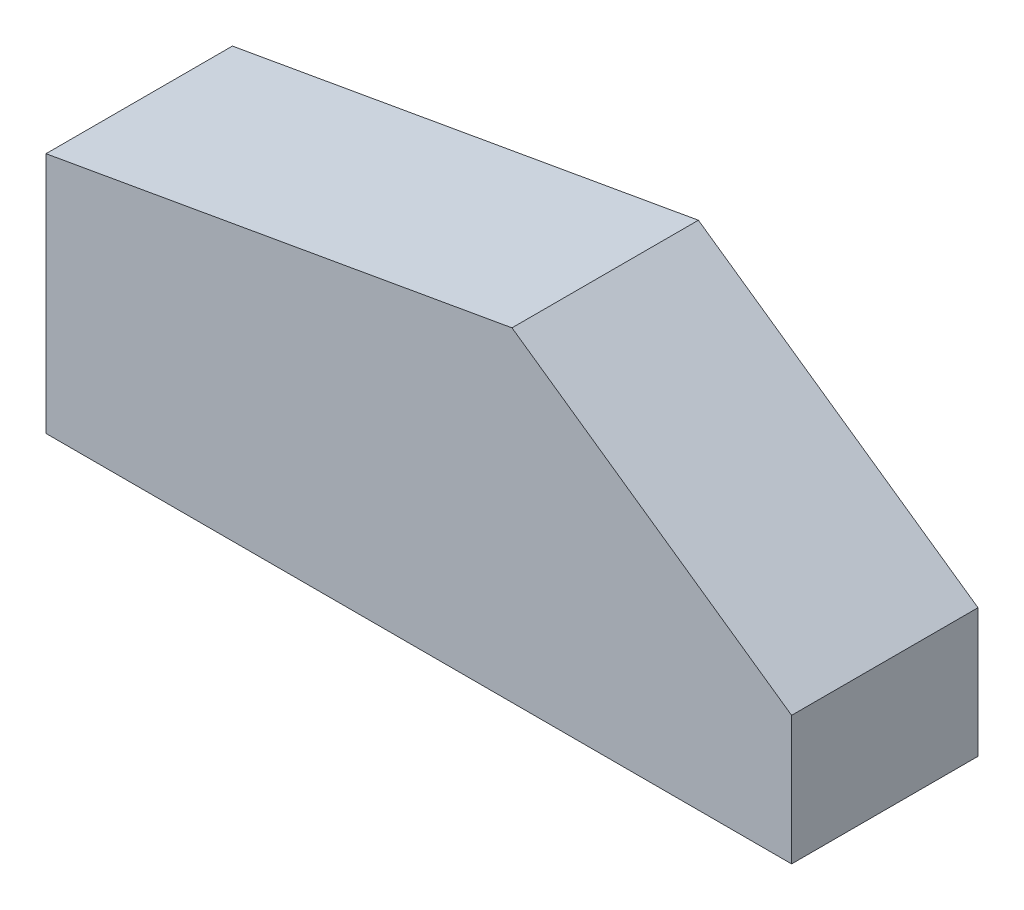
ISO-10303-21;
HEADER;
FILE_DESCRIPTION(('STEP AP214'),'2;1');
FILE_NAME('part.step','',(''),(''),'','','');
FILE_SCHEMA(('AUTOMOTIVE_DESIGN { 1 0 10303 214 1 1 1 1 }'));
ENDSEC;
DATA;
#1=APPLICATION_CONTEXT('core data for automotive mechanical design processes');
#2=APPLICATION_PROTOCOL_DEFINITION('international standard','automotive_design',2000,#1);
#3=PRODUCT_CONTEXT('',#1,'mechanical');
#4=PRODUCT('Part','Part','',(#3));
#5=PRODUCT_RELATED_PRODUCT_CATEGORY('part','',(#4));
#6=PRODUCT_DEFINITION_FORMATION('','',#4);
#7=PRODUCT_DEFINITION_CONTEXT('part definition',#1,'design');
#8=PRODUCT_DEFINITION('design','',#6,#7);
#9=PRODUCT_DEFINITION_SHAPE('','',#8);
#10=(LENGTH_UNIT() NAMED_UNIT(*) SI_UNIT(.MILLI.,.METRE.));
#11=(NAMED_UNIT(*) PLANE_ANGLE_UNIT() SI_UNIT($,.RADIAN.));
#12=(NAMED_UNIT(*) SI_UNIT($,.STERADIAN.) SOLID_ANGLE_UNIT());
#13=UNCERTAINTY_MEASURE_WITH_UNIT(LENGTH_MEASURE(1.E-05),#10,'distance_accuracy_value','');
#14=(GEOMETRIC_REPRESENTATION_CONTEXT(3) GLOBAL_UNCERTAINTY_ASSIGNED_CONTEXT((#13)) GLOBAL_UNIT_ASSIGNED_CONTEXT((#10,
#11,#12)) REPRESENTATION_CONTEXT('',''));
#15=CARTESIAN_POINT('',(0.,0.,0.));
#16=DIRECTION('',(0.,0.,1.));
#17=DIRECTION('',(1.,0.,0.));
#18=AXIS2_PLACEMENT_3D('',#15,#16,#17);
#19=CARTESIAN_POINT('',(0.,0.,10.));
#20=DIRECTION('',(0.,1.,0.));
#21=DIRECTION('',(0.,0.,1.));
#22=AXIS2_PLACEMENT_3D('',#19,#20,#21);
#23=PLANE('',#22);
#24=DIRECTION('',(1.,0.,0.));
#25=VECTOR('',#24,1.);
#26=CARTESIAN_POINT('',(0.,0.,0.));
#27=LINE('',#26,#25);
#28=CARTESIAN_POINT('',(0.,0.,0.));
#29=VERTEX_POINT('',#28);
#30=CARTESIAN_POINT('',(40.,0.,0.));
#31=VERTEX_POINT('',#30);
#32=EDGE_CURVE('E124',#29,#31,#27,.T.);
#33=ORIENTED_EDGE('',*,*,#32,.T.);
#34=DIRECTION('',(0.,0.,-1.));
#35=VECTOR('',#34,1.);
#36=CARTESIAN_POINT('',(40.,0.,10.));
#37=LINE('',#36,#35);
#38=CARTESIAN_POINT('',(40.,0.,10.));
#39=VERTEX_POINT('',#38);
#40=EDGE_CURVE('E11',#39,#31,#37,.T.);
#41=ORIENTED_EDGE('',*,*,#40,.F.);
#42=DIRECTION('',(1.,0.,0.));
#43=VECTOR('',#42,1.);
#44=CARTESIAN_POINT('',(0.,0.,10.));
#45=LINE('',#44,#43);
#46=CARTESIAN_POINT('',(0.,0.,10.));
#47=VERTEX_POINT('',#46);
#48=EDGE_CURVE('E137',#47,#39,#45,.T.);
#49=ORIENTED_EDGE('',*,*,#48,.F.);
#50=DIRECTION('',(0.,0.,-1.));
#51=VECTOR('',#50,1.);
#52=CARTESIAN_POINT('',(0.,0.,10.));
#53=LINE('',#52,#51);
#54=EDGE_CURVE('E120',#47,#29,#53,.T.);
#55=ORIENTED_EDGE('',*,*,#54,.T.);
#56=EDGE_LOOP('',(#33,#41,#49,#55));
#57=FACE_BOUND('',#56,.T.);
#58=ADVANCED_FACE('F45',(#57),#23,.F.);
#59=CARTESIAN_POINT('',(40.,0.,10.));
#60=DIRECTION('',(-1.,0.,0.));
#61=DIRECTION('',(0.,0.,1.));
#62=AXIS2_PLACEMENT_3D('',#59,#60,#61);
#63=PLANE('',#62);
#64=DIRECTION('',(0.,1.,0.));
#65=VECTOR('',#64,1.);
#66=CARTESIAN_POINT('',(40.,0.,0.));
#67=LINE('',#66,#65);
#68=CARTESIAN_POINT('',(40.,6.90506144456578,0.));
#69=VERTEX_POINT('',#68);
#70=EDGE_CURVE('E128',#31,#69,#67,.T.);
#71=ORIENTED_EDGE('',*,*,#70,.T.);
#72=DIRECTION('',(0.,0.,-1.));
#73=VECTOR('',#72,1.);
#74=CARTESIAN_POINT('',(40.,6.90506144456578,10.));
#75=LINE('',#74,#73);
#76=CARTESIAN_POINT('',(40.,6.90506144456578,10.));
#77=VERTEX_POINT('',#76);
#78=EDGE_CURVE('E54',#77,#69,#75,.T.);
#79=ORIENTED_EDGE('',*,*,#78,.F.);
#80=DIRECTION('',(0.,1.,0.));
#81=VECTOR('',#80,1.);
#82=CARTESIAN_POINT('',(40.,0.,10.));
#83=LINE('',#82,#81);
#84=EDGE_CURVE('E96',#39,#77,#83,.T.);
#85=ORIENTED_EDGE('',*,*,#84,.F.);
#86=ORIENTED_EDGE('',*,*,#40,.T.);
#87=EDGE_LOOP('',(#71,#79,#85,#86));
#88=FACE_BOUND('',#87,.T.);
#89=ADVANCED_FACE('F159',(#88),#63,.F.);
#90=CARTESIAN_POINT('',(25.,17.4081745177115,10.));
#91=DIRECTION('',(-0.57357643635105,-0.819152044288989,0.));
#92=DIRECTION('',(0.819152044288989,-0.57357643635105,0.));
#93=AXIS2_PLACEMENT_3D('',#90,#91,#92);
#94=PLANE('',#93);
#95=DIRECTION('',(-0.819152044288989,0.57357643635105,0.));
#96=VECTOR('',#95,1.);
#97=CARTESIAN_POINT('',(25.,17.4081745177115,0.));
#98=LINE('',#97,#96);
#99=CARTESIAN_POINT('',(25.,17.4081745177115,0.));
#100=VERTEX_POINT('',#99);
#101=EDGE_CURVE('E112',#69,#100,#98,.T.);
#102=ORIENTED_EDGE('',*,*,#101,.T.);
#103=DIRECTION('',(0.,0.,-1.));
#104=VECTOR('',#103,1.);
#105=CARTESIAN_POINT('',(25.,17.4081745177115,10.));
#106=LINE('',#105,#104);
#107=CARTESIAN_POINT('',(25.,17.4081745177115,10.));
#108=VERTEX_POINT('',#107);
#109=EDGE_CURVE('E109',#108,#100,#106,.T.);
#110=ORIENTED_EDGE('',*,*,#109,.F.);
#111=DIRECTION('',(-0.819152044288989,0.57357643635105,0.));
#112=VECTOR('',#111,1.);
#113=CARTESIAN_POINT('',(25.,17.4081745177115,10.));
#114=LINE('',#113,#112);
#115=EDGE_CURVE('E100',#77,#108,#114,.T.);
#116=ORIENTED_EDGE('',*,*,#115,.F.);
#117=ORIENTED_EDGE('',*,*,#78,.T.);
#118=EDGE_LOOP('',(#102,#110,#116,#117));
#119=FACE_BOUND('',#118,.T.);
#120=ADVANCED_FACE('F110',(#119),#94,.F.);
#121=CARTESIAN_POINT('',(0.,13.,10.));
#122=DIRECTION('',(0.173648177666927,-0.984807753012209,0.));
#123=DIRECTION('',(0.984807753012209,0.173648177666927,0.));
#124=AXIS2_PLACEMENT_3D('',#121,#122,#123);
#125=PLANE('',#124);
#126=DIRECTION('',(-0.984807753012209,-0.173648177666927,0.));
#127=VECTOR('',#126,1.);
#128=CARTESIAN_POINT('',(0.,13.,0.));
#129=LINE('',#128,#127);
#130=CARTESIAN_POINT('',(0.,13.,0.));
#131=VERTEX_POINT('',#130);
#132=EDGE_CURVE('E82',#100,#131,#129,.T.);
#133=ORIENTED_EDGE('',*,*,#132,.T.);
#134=DIRECTION('',(0.,0.,-1.));
#135=VECTOR('',#134,1.);
#136=CARTESIAN_POINT('',(0.,13.,10.));
#137=LINE('',#136,#135);
#138=CARTESIAN_POINT('',(0.,13.,10.));
#139=VERTEX_POINT('',#138);
#140=EDGE_CURVE('E114',#139,#131,#137,.T.);
#141=ORIENTED_EDGE('',*,*,#140,.F.);
#142=DIRECTION('',(-0.984807753012209,-0.173648177666927,0.));
#143=VECTOR('',#142,1.);
#144=CARTESIAN_POINT('',(0.,13.,10.));
#145=LINE('',#144,#143);
#146=EDGE_CURVE('E104',#108,#139,#145,.T.);
#147=ORIENTED_EDGE('',*,*,#146,.F.);
#148=ORIENTED_EDGE('',*,*,#109,.T.);
#149=EDGE_LOOP('',(#133,#141,#147,#148));
#150=FACE_BOUND('',#149,.T.);
#151=ADVANCED_FACE('F116',(#150),#125,.F.);
#152=CARTESIAN_POINT('',(0.,0.,10.));
#153=DIRECTION('',(1.,0.,0.));
#154=DIRECTION('',(0.,0.,-1.));
#155=AXIS2_PLACEMENT_3D('',#152,#153,#154);
#156=PLANE('',#155);
#157=DIRECTION('',(0.,-1.,0.));
#158=VECTOR('',#157,1.);
#159=CARTESIAN_POINT('',(0.,0.,0.));
#160=LINE('',#159,#158);
#161=EDGE_CURVE('E88',#131,#29,#160,.T.);
#162=ORIENTED_EDGE('',*,*,#161,.T.);
#163=ORIENTED_EDGE('',*,*,#54,.F.);
#164=DIRECTION('',(0.,-1.,0.));
#165=VECTOR('',#164,1.);
#166=CARTESIAN_POINT('',(0.,0.,10.));
#167=LINE('',#166,#165);
#168=EDGE_CURVE('E62',#139,#47,#167,.T.);
#169=ORIENTED_EDGE('',*,*,#168,.F.);
#170=ORIENTED_EDGE('',*,*,#140,.T.);
#171=EDGE_LOOP('',(#162,#163,#169,#170));
#172=FACE_BOUND('',#171,.T.);
#173=ADVANCED_FACE('F148',(#172),#156,.F.);
#174=CARTESIAN_POINT('',(0.,0.,10.));
#175=DIRECTION('',(0.,0.,1.));
#176=DIRECTION('',(1.,0.,0.));
#177=AXIS2_PLACEMENT_3D('',#174,#175,#176);
#178=PLANE('',#177);
#179=ORIENTED_EDGE('',*,*,#48,.T.);
#180=ORIENTED_EDGE('',*,*,#84,.T.);
#181=ORIENTED_EDGE('',*,*,#115,.T.);
#182=ORIENTED_EDGE('',*,*,#146,.T.);
#183=ORIENTED_EDGE('',*,*,#168,.T.);
#184=EDGE_LOOP('',(#179,#180,#181,#182,#183));
#185=FACE_BOUND('',#184,.T.);
#186=ADVANCED_FACE('F102',(#185),#178,.T.);
#187=CARTESIAN_POINT('',(0.,0.,0.));
#188=DIRECTION('',(0.,0.,1.));
#189=DIRECTION('',(1.,0.,0.));
#190=AXIS2_PLACEMENT_3D('',#187,#188,#189);
#191=PLANE('',#190);
#192=ORIENTED_EDGE('',*,*,#32,.F.);
#193=ORIENTED_EDGE('',*,*,#161,.F.);
#194=ORIENTED_EDGE('',*,*,#132,.F.);
#195=ORIENTED_EDGE('',*,*,#101,.F.);
#196=ORIENTED_EDGE('',*,*,#70,.F.);
#197=EDGE_LOOP('',(#192,#193,#194,#195,#196));
#198=FACE_BOUND('',#197,.T.);
#199=ADVANCED_FACE('F144',(#198),#191,.F.);
#200=CLOSED_SHELL('',(#58,#89,#120,#151,#173,#186,#199));
#201=MANIFOLD_SOLID_BREP('B2',#200);
#202=ADVANCED_BREP_SHAPE_REPRESENTATION('',(#18,#201),#14);
#203=SHAPE_DEFINITION_REPRESENTATION(#9,#202);
ENDSEC;
END-ISO-10303-21;
